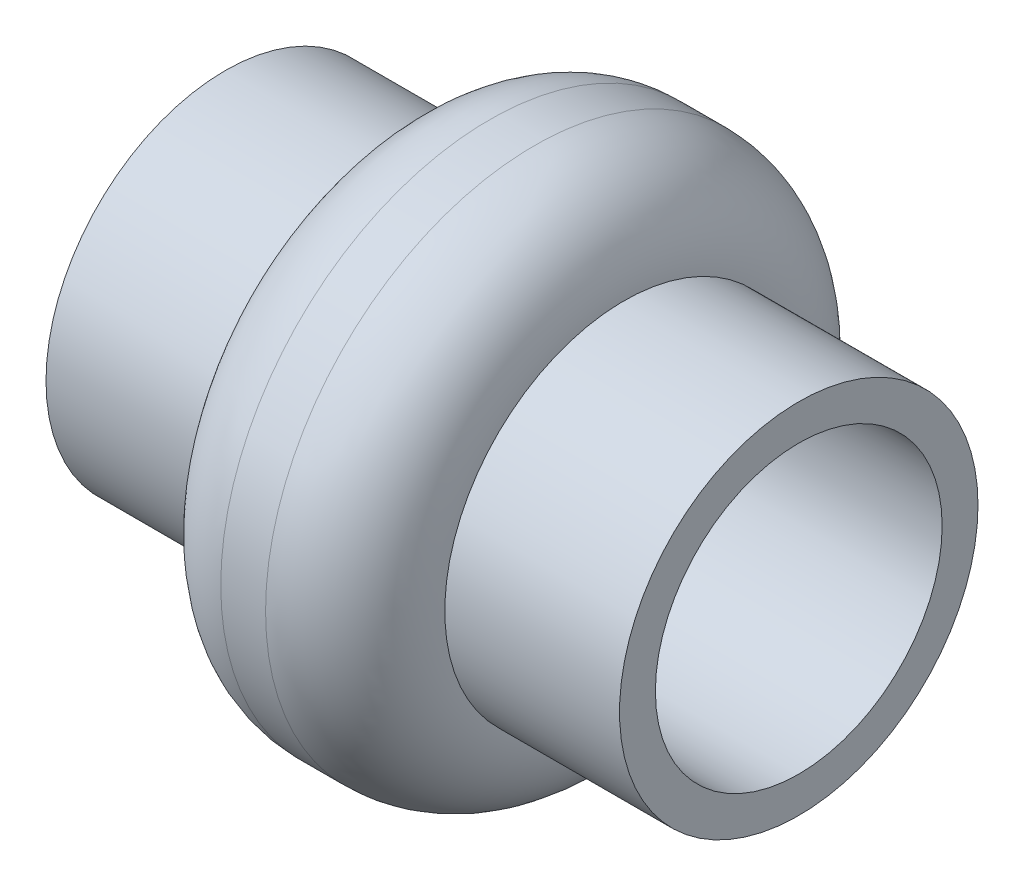
ISO-10303-21;
HEADER;
FILE_DESCRIPTION(('STEP AP214'),'2;1');
FILE_NAME('part.step','',(''),(''),'','','');
FILE_SCHEMA(('AUTOMOTIVE_DESIGN { 1 0 10303 214 1 1 1 1 }'));
ENDSEC;
DATA;
#1=APPLICATION_CONTEXT('core data for automotive mechanical design processes');
#2=APPLICATION_PROTOCOL_DEFINITION('international standard','automotive_design',2000,#1);
#3=PRODUCT_CONTEXT('',#1,'mechanical');
#4=PRODUCT('Part','Part','',(#3));
#5=PRODUCT_RELATED_PRODUCT_CATEGORY('part','',(#4));
#6=PRODUCT_DEFINITION_FORMATION('','',#4);
#7=PRODUCT_DEFINITION_CONTEXT('part definition',#1,'design');
#8=PRODUCT_DEFINITION('design','',#6,#7);
#9=PRODUCT_DEFINITION_SHAPE('','',#8);
#10=(LENGTH_UNIT() NAMED_UNIT(*) SI_UNIT(.MILLI.,.METRE.));
#11=(NAMED_UNIT(*) PLANE_ANGLE_UNIT() SI_UNIT($,.RADIAN.));
#12=(NAMED_UNIT(*) SI_UNIT($,.STERADIAN.) SOLID_ANGLE_UNIT());
#13=UNCERTAINTY_MEASURE_WITH_UNIT(LENGTH_MEASURE(1.E-05),#10,'distance_accuracy_value','');
#14=(GEOMETRIC_REPRESENTATION_CONTEXT(3) GLOBAL_UNCERTAINTY_ASSIGNED_CONTEXT((#13)) GLOBAL_UNIT_ASSIGNED_CONTEXT((#10,
#11,#12)) REPRESENTATION_CONTEXT('',''));
#15=CARTESIAN_POINT('',(0.,0.,0.));
#16=DIRECTION('',(0.,0.,1.));
#17=DIRECTION('',(1.,0.,0.));
#18=AXIS2_PLACEMENT_3D('',#15,#16,#17);
#19=CARTESIAN_POINT('',(1.25,0.,0.));
#20=DIRECTION('',(-1.,0.,0.));
#21=DIRECTION('',(0.,0.,1.));
#22=AXIS2_PLACEMENT_3D('',#19,#20,#21);
#23=CYLINDRICAL_SURFACE('',#22,3.);
#24=CARTESIAN_POINT('',(-0.25,0.,0.));
#25=DIRECTION('',(1.,0.,0.));
#26=DIRECTION('',(0.,0.,-1.));
#27=AXIS2_PLACEMENT_3D('',#24,#25,#26);
#28=CIRCLE('',#27,3.);
#29=CARTESIAN_POINT('',(-0.25,0.,-3.));
#30=VERTEX_POINT('',#29);
#31=EDGE_CURVE('E11',#30,#30,#28,.T.);
#32=ORIENTED_EDGE('',*,*,#31,.T.);
#33=EDGE_LOOP('',(#32));
#34=FACE_BOUND('',#33,.T.);
#35=CARTESIAN_POINT('',(0.25,0.,0.));
#36=DIRECTION('',(1.,0.,0.));
#37=DIRECTION('',(0.,0.,-1.));
#38=AXIS2_PLACEMENT_3D('',#35,#36,#37);
#39=CIRCLE('',#38,3.);
#40=CARTESIAN_POINT('',(0.25,0.,-3.));
#41=VERTEX_POINT('',#40);
#42=EDGE_CURVE('E39',#41,#41,#39,.F.);
#43=ORIENTED_EDGE('',*,*,#42,.T.);
#44=EDGE_LOOP('',(#43));
#45=FACE_BOUND('',#44,.T.);
#46=ADVANCED_FACE('F32',(#34,#45),#23,.T.);
#47=CARTESIAN_POINT('',(12.0568542494924,0.,0.));
#48=DIRECTION('',(-1.,0.,0.));
#49=DIRECTION('',(0.,0.,1.));
#50=AXIS2_PLACEMENT_3D('',#47,#48,#49);
#51=CYLINDRICAL_SURFACE('',#50,2.);
#52=CARTESIAN_POINT('',(1.25,0.,0.));
#53=DIRECTION('',(1.,0.,0.));
#54=DIRECTION('',(0.,0.,-1.));
#55=AXIS2_PLACEMENT_3D('',#52,#53,#54);
#56=CIRCLE('',#55,2.);
#57=CARTESIAN_POINT('',(1.25,0.,-2.));
#58=VERTEX_POINT('',#57);
#59=EDGE_CURVE('E52',#58,#58,#56,.T.);
#60=ORIENTED_EDGE('',*,*,#59,.T.);
#61=EDGE_LOOP('',(#60));
#62=FACE_BOUND('',#61,.T.);
#63=CARTESIAN_POINT('',(3.2,0.,0.));
#64=DIRECTION('',(1.,0.,0.));
#65=DIRECTION('',(0.,0.,-1.));
#66=AXIS2_PLACEMENT_3D('',#63,#64,#65);
#67=CIRCLE('',#66,2.);
#68=CARTESIAN_POINT('',(3.2,0.,-2.));
#69=VERTEX_POINT('',#68);
#70=EDGE_CURVE('E47',#69,#69,#67,.T.);
#71=ORIENTED_EDGE('',*,*,#70,.F.);
#72=EDGE_LOOP('',(#71));
#73=FACE_BOUND('',#72,.T.);
#74=ADVANCED_FACE('F79',(#62,#73),#51,.T.);
#75=CARTESIAN_POINT('',(3.2,0.,0.));
#76=DIRECTION('',(1.,0.,0.));
#77=DIRECTION('',(0.,0.,-1.));
#78=AXIS2_PLACEMENT_3D('',#75,#76,#77);
#79=PLANE('',#78);
#80=CARTESIAN_POINT('',(3.2,0.,0.));
#81=DIRECTION('',(1.,0.,0.));
#82=DIRECTION('',(0.,0.,-1.));
#83=AXIS2_PLACEMENT_3D('',#80,#81,#82);
#84=CIRCLE('',#83,1.6);
#85=CARTESIAN_POINT('',(3.2,0.,-1.6));
#86=VERTEX_POINT('',#85);
#87=EDGE_CURVE('E59',#86,#86,#84,.T.);
#88=ORIENTED_EDGE('',*,*,#87,.F.);
#89=EDGE_LOOP('',(#88));
#90=FACE_BOUND('',#89,.T.);
#91=ORIENTED_EDGE('',*,*,#70,.T.);
#92=EDGE_LOOP('',(#91));
#93=FACE_BOUND('',#92,.T.);
#94=ADVANCED_FACE('F75',(#90,#93),#79,.T.);
#95=CARTESIAN_POINT('',(-3.2,0.,0.));
#96=DIRECTION('',(1.,0.,0.));
#97=DIRECTION('',(0.,0.,-1.));
#98=AXIS2_PLACEMENT_3D('',#95,#96,#97);
#99=CYLINDRICAL_SURFACE('',#98,2.);
#100=CARTESIAN_POINT('',(-3.2,0.,0.));
#101=DIRECTION('',(-1.,0.,0.));
#102=DIRECTION('',(0.,0.,1.));
#103=AXIS2_PLACEMENT_3D('',#100,#101,#102);
#104=CIRCLE('',#103,2.);
#105=CARTESIAN_POINT('',(-3.2,0.,2.));
#106=VERTEX_POINT('',#105);
#107=EDGE_CURVE('E55',#106,#106,#104,.T.);
#108=ORIENTED_EDGE('',*,*,#107,.F.);
#109=EDGE_LOOP('',(#108));
#110=FACE_BOUND('',#109,.T.);
#111=CARTESIAN_POINT('',(-1.25,0.,0.));
#112=DIRECTION('',(1.,0.,0.));
#113=DIRECTION('',(0.,0.,-1.));
#114=AXIS2_PLACEMENT_3D('',#111,#112,#113);
#115=CIRCLE('',#114,2.);
#116=CARTESIAN_POINT('',(-1.25,0.,-2.));
#117=VERTEX_POINT('',#116);
#118=EDGE_CURVE('E43',#117,#117,#115,.F.);
#119=ORIENTED_EDGE('',*,*,#118,.T.);
#120=EDGE_LOOP('',(#119));
#121=FACE_BOUND('',#120,.T.);
#122=ADVANCED_FACE('F78',(#110,#121),#99,.T.);
#123=CARTESIAN_POINT('',(-3.2,0.,0.));
#124=DIRECTION('',(-1.,0.,0.));
#125=DIRECTION('',(0.,0.,1.));
#126=AXIS2_PLACEMENT_3D('',#123,#124,#125);
#127=PLANE('',#126);
#128=CARTESIAN_POINT('',(-3.2,0.,0.));
#129=DIRECTION('',(1.,0.,0.));
#130=DIRECTION('',(0.,0.,-1.));
#131=AXIS2_PLACEMENT_3D('',#128,#129,#130);
#132=CIRCLE('',#131,1.6);
#133=CARTESIAN_POINT('',(-3.2,0.,-1.6));
#134=VERTEX_POINT('',#133);
#135=EDGE_CURVE('E58',#134,#134,#132,.T.);
#136=ORIENTED_EDGE('',*,*,#135,.T.);
#137=EDGE_LOOP('',(#136));
#138=FACE_BOUND('',#137,.T.);
#139=ORIENTED_EDGE('',*,*,#107,.T.);
#140=EDGE_LOOP('',(#139));
#141=FACE_BOUND('',#140,.T.);
#142=ADVANCED_FACE('F65',(#138,#141),#127,.T.);
#143=CARTESIAN_POINT('',(-3.2,0.,0.));
#144=DIRECTION('',(1.,0.,0.));
#145=DIRECTION('',(0.,0.,-1.));
#146=AXIS2_PLACEMENT_3D('',#143,#144,#145);
#147=CYLINDRICAL_SURFACE('',#146,1.6);
#148=CARTESIAN_POINT('',(-3.2,0.,-1.6));
#149=CARTESIAN_POINT('',(-3.13333333333333,0.,-1.6));
#150=CARTESIAN_POINT('',(-3.06666666666667,0.,-1.6));
#151=CARTESIAN_POINT('',(-2.93333333333333,0.,-1.6));
#152=CARTESIAN_POINT('',(-2.86666666666667,0.,-1.6));
#153=CARTESIAN_POINT('',(-2.73333333333333,0.,-1.6));
#154=CARTESIAN_POINT('',(-2.66666666666667,0.,-1.6));
#155=CARTESIAN_POINT('',(-2.53333333333333,0.,-1.6));
#156=CARTESIAN_POINT('',(-2.46666666666667,0.,-1.6));
#157=CARTESIAN_POINT('',(-2.33333333333333,0.,-1.6));
#158=CARTESIAN_POINT('',(-2.26666666666667,0.,-1.6));
#159=CARTESIAN_POINT('',(-2.13333333333333,0.,-1.6));
#160=CARTESIAN_POINT('',(-2.06666666666667,0.,-1.6));
#161=CARTESIAN_POINT('',(-1.93333333333333,0.,-1.6));
#162=CARTESIAN_POINT('',(-1.86666666666667,0.,-1.6));
#163=CARTESIAN_POINT('',(-1.73333333333333,0.,-1.6));
#164=CARTESIAN_POINT('',(-1.66666666666667,0.,-1.6));
#165=CARTESIAN_POINT('',(-1.53333333333333,0.,-1.6));
#166=CARTESIAN_POINT('',(-1.46666666666667,0.,-1.6));
#167=CARTESIAN_POINT('',(-1.33333333333333,0.,-1.6));
#168=CARTESIAN_POINT('',(-1.26666666666667,0.,-1.6));
#169=CARTESIAN_POINT('',(-1.13333333333333,0.,-1.6));
#170=CARTESIAN_POINT('',(-1.06666666666667,0.,-1.6));
#171=CARTESIAN_POINT('',(-0.933333333333334,0.,-1.6));
#172=CARTESIAN_POINT('',(-0.866666666666667,0.,-1.6));
#173=CARTESIAN_POINT('',(-0.733333333333334,0.,-1.6));
#174=CARTESIAN_POINT('',(-0.666666666666667,0.,-1.6));
#175=CARTESIAN_POINT('',(-0.533333333333334,0.,-1.6));
#176=CARTESIAN_POINT('',(-0.466666666666667,0.,-1.6));
#177=CARTESIAN_POINT('',(-0.333333333333334,0.,-1.6));
#178=CARTESIAN_POINT('',(-0.266666666666667,0.,-1.6));
#179=CARTESIAN_POINT('',(-0.133333333333334,0.,-1.6));
#180=CARTESIAN_POINT('',(-0.0666666666666671,0.,-1.6));
#181=CARTESIAN_POINT('',(0.0666666666666662,0.,-1.6));
#182=CARTESIAN_POINT('',(0.133333333333333,0.,-1.6));
#183=CARTESIAN_POINT('',(0.266666666666666,0.,-1.6));
#184=CARTESIAN_POINT('',(0.333333333333333,0.,-1.6));
#185=CARTESIAN_POINT('',(0.466666666666666,0.,-1.6));
#186=CARTESIAN_POINT('',(0.533333333333333,0.,-1.6));
#187=CARTESIAN_POINT('',(0.666666666666666,0.,-1.6));
#188=CARTESIAN_POINT('',(0.733333333333333,0.,-1.6));
#189=CARTESIAN_POINT('',(0.866666666666666,0.,-1.6));
#190=CARTESIAN_POINT('',(0.933333333333333,0.,-1.6));
#191=CARTESIAN_POINT('',(1.06666666666667,0.,-1.6));
#192=CARTESIAN_POINT('',(1.13333333333333,0.,-1.6));
#193=CARTESIAN_POINT('',(1.26666666666667,0.,-1.6));
#194=CARTESIAN_POINT('',(1.33333333333333,0.,-1.6));
#195=CARTESIAN_POINT('',(1.46666666666667,0.,-1.6));
#196=CARTESIAN_POINT('',(1.53333333333333,0.,-1.6));
#197=CARTESIAN_POINT('',(1.66666666666667,0.,-1.6));
#198=CARTESIAN_POINT('',(1.73333333333333,0.,-1.6));
#199=CARTESIAN_POINT('',(1.86666666666667,0.,-1.6));
#200=CARTESIAN_POINT('',(1.93333333333333,0.,-1.6));
#201=CARTESIAN_POINT('',(2.06666666666667,0.,-1.6));
#202=CARTESIAN_POINT('',(2.13333333333333,0.,-1.6));
#203=CARTESIAN_POINT('',(2.26666666666667,0.,-1.6));
#204=CARTESIAN_POINT('',(2.33333333333333,0.,-1.6));
#205=CARTESIAN_POINT('',(2.46666666666667,0.,-1.6));
#206=CARTESIAN_POINT('',(2.53333333333333,0.,-1.6));
#207=CARTESIAN_POINT('',(2.66666666666667,0.,-1.6));
#208=CARTESIAN_POINT('',(2.73333333333333,0.,-1.6));
#209=CARTESIAN_POINT('',(2.86666666666667,0.,-1.6));
#210=CARTESIAN_POINT('',(2.93333333333333,0.,-1.6));
#211=CARTESIAN_POINT('',(3.06666666666667,0.,-1.6));
#212=CARTESIAN_POINT('',(3.13333333333333,0.,-1.6));
#213=CARTESIAN_POINT('',(3.2,0.,-1.6));
#214=B_SPLINE_CURVE_WITH_KNOTS('',3,(#148,#149,#150,#151,#152,#153,#154,#155,#156,#157,#158,
#159,#160,#161,#162,#163,#164,#165,#166,#167,#168,#169,#170,#171,#172,#173,#174,#175,#176,#177,
#178,#179,#180,#181,#182,#183,#184,#185,#186,#187,#188,#189,#190,#191,#192,#193,#194,#195,#196,
#197,#198,#199,#200,#201,#202,#203,#204,#205,#206,#207,#208,#209,#210,#211,#212,#213),
.UNSPECIFIED.,.F.,.F.,(4,2,2,2,2,2,2,2,2,2,2,2,2,2,2,2,2,2,2,2,2,2,2,2,2,2,2,2,2,2,2,2,4),(0.,
0.2,0.4,0.6,0.8,1.,1.2,1.4,1.6,1.8,2.,2.2,2.4,2.6,2.8,3.,3.2,3.4,3.6,3.8,4.,4.2,4.4,4.6,4.8,5.,
5.2,5.4,5.6,5.8,6.,6.2,6.4),.UNSPECIFIED.);
#215=EDGE_CURVE('BSEAM68',#134,#86,#214,.T.);
#216=ORIENTED_EDGE('',*,*,#135,.F.);
#217=ORIENTED_EDGE('',*,*,#87,.T.);
#218=ORIENTED_EDGE('',*,*,#215,.T.);
#219=ORIENTED_EDGE('',*,*,#215,.F.);
#220=EDGE_LOOP('',(#216,#218,#217,#219));
#221=FACE_BOUND('',#220,.T.);
#222=ADVANCED_FACE('F68',(#221),#147,.F.);
#223=CARTESIAN_POINT('',(-0.25,0.,0.));
#224=DIRECTION('',(1.,0.,0.));
#225=DIRECTION('',(0.,0.,-1.));
#226=AXIS2_PLACEMENT_3D('',#223,#224,#225);
#227=TOROIDAL_SURFACE('',#226,2.,1.);
#228=ORIENTED_EDGE('',*,*,#118,.F.);
#229=EDGE_LOOP('',(#228));
#230=FACE_BOUND('',#229,.T.);
#231=ORIENTED_EDGE('',*,*,#31,.F.);
#232=EDGE_LOOP('',(#231));
#233=FACE_BOUND('',#232,.T.);
#234=ADVANCED_FACE('F71',(#230,#233),#227,.T.);
#235=CARTESIAN_POINT('',(0.25,0.,0.));
#236=DIRECTION('',(1.,0.,0.));
#237=DIRECTION('',(0.,0.,-1.));
#238=AXIS2_PLACEMENT_3D('',#235,#236,#237);
#239=TOROIDAL_SURFACE('',#238,2.,1.);
#240=ORIENTED_EDGE('',*,*,#42,.F.);
#241=EDGE_LOOP('',(#240));
#242=FACE_BOUND('',#241,.T.);
#243=ORIENTED_EDGE('',*,*,#59,.F.);
#244=EDGE_LOOP('',(#243));
#245=FACE_BOUND('',#244,.T.);
#246=ADVANCED_FACE('F34',(#242,#245),#239,.T.);
#247=CLOSED_SHELL('',(#46,#74,#94,#122,#142,#222,#234,#246));
#248=MANIFOLD_SOLID_BREP('B2',#247);
#249=ADVANCED_BREP_SHAPE_REPRESENTATION('',(#18,#248),#14);
#250=SHAPE_DEFINITION_REPRESENTATION(#9,#249);
ENDSEC;
END-ISO-10303-21;
